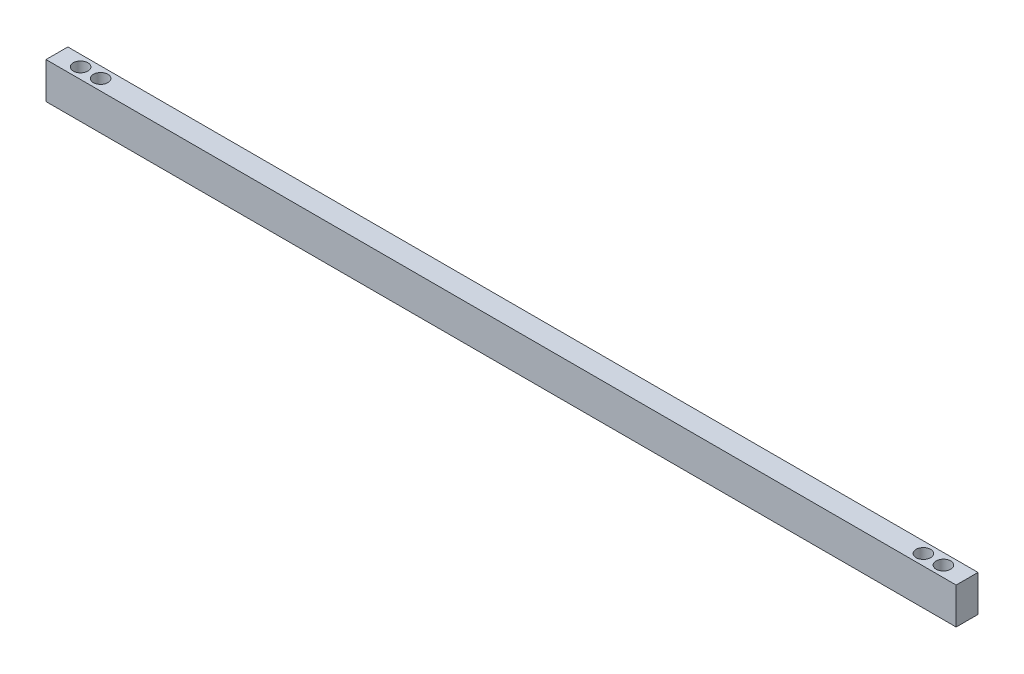
ISO-10303-21;
HEADER;
FILE_DESCRIPTION(('STEP AP214'),'2;1');
FILE_NAME('part.step','',(''),(''),'','','');
FILE_SCHEMA(('AUTOMOTIVE_DESIGN { 1 0 10303 214 1 1 1 1 }'));
ENDSEC;
DATA;
#1=APPLICATION_CONTEXT('core data for automotive mechanical design processes');
#2=APPLICATION_PROTOCOL_DEFINITION('international standard','automotive_design',2000,#1);
#3=PRODUCT_CONTEXT('',#1,'mechanical');
#4=PRODUCT('Part','Part','',(#3));
#5=PRODUCT_RELATED_PRODUCT_CATEGORY('part','',(#4));
#6=PRODUCT_DEFINITION_FORMATION('','',#4);
#7=PRODUCT_DEFINITION_CONTEXT('part definition',#1,'design');
#8=PRODUCT_DEFINITION('design','',#6,#7);
#9=PRODUCT_DEFINITION_SHAPE('','',#8);
#10=(LENGTH_UNIT() NAMED_UNIT(*) SI_UNIT(.MILLI.,.METRE.));
#11=(NAMED_UNIT(*) PLANE_ANGLE_UNIT() SI_UNIT($,.RADIAN.));
#12=(NAMED_UNIT(*) SI_UNIT($,.STERADIAN.) SOLID_ANGLE_UNIT());
#13=UNCERTAINTY_MEASURE_WITH_UNIT(LENGTH_MEASURE(1.E-05),#10,'distance_accuracy_value','');
#14=(GEOMETRIC_REPRESENTATION_CONTEXT(3) GLOBAL_UNCERTAINTY_ASSIGNED_CONTEXT((#13)) GLOBAL_UNIT_ASSIGNED_CONTEXT((#10,
#11,#12)) REPRESENTATION_CONTEXT('',''));
#15=CARTESIAN_POINT('',(0.,0.,0.));
#16=DIRECTION('',(0.,0.,1.));
#17=DIRECTION('',(1.,0.,0.));
#18=AXIS2_PLACEMENT_3D('',#15,#16,#17);
#19=CARTESIAN_POINT('',(317.5,25.4,7.62));
#20=DIRECTION('',(-1.,0.,0.));
#21=DIRECTION('',(0.,0.,1.));
#22=AXIS2_PLACEMENT_3D('',#19,#20,#21);
#23=PLANE('',#22);
#24=DIRECTION('',(0.,0.,-1.));
#25=VECTOR('',#24,1.);
#26=CARTESIAN_POINT('',(317.5,0.,7.62));
#27=LINE('',#26,#25);
#28=CARTESIAN_POINT('',(317.5,0.,7.62));
#29=VERTEX_POINT('',#28);
#30=CARTESIAN_POINT('',(317.5,0.,-7.62));
#31=VERTEX_POINT('',#30);
#32=EDGE_CURVE('E99',#29,#31,#27,.T.);
#33=ORIENTED_EDGE('',*,*,#32,.T.);
#34=DIRECTION('',(0.,-1.,0.));
#35=VECTOR('',#34,1.);
#36=CARTESIAN_POINT('',(317.5,25.4,-7.62));
#37=LINE('',#36,#35);
#38=CARTESIAN_POINT('',(317.5,25.4,-7.62));
#39=VERTEX_POINT('',#38);
#40=EDGE_CURVE('E11',#39,#31,#37,.T.);
#41=ORIENTED_EDGE('',*,*,#40,.F.);
#42=DIRECTION('',(0.,0.,-1.));
#43=VECTOR('',#42,1.);
#44=CARTESIAN_POINT('',(317.5,25.4,7.62));
#45=LINE('',#44,#43);
#46=CARTESIAN_POINT('',(317.5,25.4,7.62));
#47=VERTEX_POINT('',#46);
#48=EDGE_CURVE('E86',#47,#39,#45,.T.);
#49=ORIENTED_EDGE('',*,*,#48,.F.);
#50=DIRECTION('',(0.,-1.,0.));
#51=VECTOR('',#50,1.);
#52=CARTESIAN_POINT('',(317.5,25.4,7.62));
#53=LINE('',#52,#51);
#54=EDGE_CURVE('E95',#47,#29,#53,.T.);
#55=ORIENTED_EDGE('',*,*,#54,.T.);
#56=EDGE_LOOP('',(#33,#41,#49,#55));
#57=FACE_BOUND('',#56,.T.);
#58=ADVANCED_FACE('F33',(#57),#23,.F.);
#59=CARTESIAN_POINT('',(-317.5,25.4,-7.62));
#60=DIRECTION('',(0.,0.,1.));
#61=DIRECTION('',(1.,0.,0.));
#62=AXIS2_PLACEMENT_3D('',#59,#60,#61);
#63=PLANE('',#62);
#64=DIRECTION('',(-1.,0.,0.));
#65=VECTOR('',#64,1.);
#66=CARTESIAN_POINT('',(-317.5,0.,-7.62));
#67=LINE('',#66,#65);
#68=CARTESIAN_POINT('',(-317.5,0.,-7.62));
#69=VERTEX_POINT('',#68);
#70=EDGE_CURVE('E90',#31,#69,#67,.T.);
#71=ORIENTED_EDGE('',*,*,#70,.T.);
#72=DIRECTION('',(0.,-1.,0.));
#73=VECTOR('',#72,1.);
#74=CARTESIAN_POINT('',(-317.5,25.4,-7.62));
#75=LINE('',#74,#73);
#76=CARTESIAN_POINT('',(-317.5,25.4,-7.62));
#77=VERTEX_POINT('',#76);
#78=EDGE_CURVE('E42',#77,#69,#75,.T.);
#79=ORIENTED_EDGE('',*,*,#78,.F.);
#80=DIRECTION('',(-1.,0.,0.));
#81=VECTOR('',#80,1.);
#82=CARTESIAN_POINT('',(-317.5,25.4,-7.62));
#83=LINE('',#82,#81);
#84=EDGE_CURVE('E81',#39,#77,#83,.T.);
#85=ORIENTED_EDGE('',*,*,#84,.F.);
#86=ORIENTED_EDGE('',*,*,#40,.T.);
#87=EDGE_LOOP('',(#71,#79,#85,#86));
#88=FACE_BOUND('',#87,.T.);
#89=ADVANCED_FACE('F89',(#88),#63,.F.);
#90=CARTESIAN_POINT('',(-317.5,25.4,7.62));
#91=DIRECTION('',(1.,0.,0.));
#92=DIRECTION('',(0.,0.,-1.));
#93=AXIS2_PLACEMENT_3D('',#90,#91,#92);
#94=PLANE('',#93);
#95=DIRECTION('',(0.,0.,1.));
#96=VECTOR('',#95,1.);
#97=CARTESIAN_POINT('',(-317.5,0.,7.62));
#98=LINE('',#97,#96);
#99=CARTESIAN_POINT('',(-317.5,0.,7.62));
#100=VERTEX_POINT('',#99);
#101=EDGE_CURVE('E68',#69,#100,#98,.T.);
#102=ORIENTED_EDGE('',*,*,#101,.T.);
#103=DIRECTION('',(0.,-1.,0.));
#104=VECTOR('',#103,1.);
#105=CARTESIAN_POINT('',(-317.5,25.4,7.62));
#106=LINE('',#105,#104);
#107=CARTESIAN_POINT('',(-317.5,25.4,7.62));
#108=VERTEX_POINT('',#107);
#109=EDGE_CURVE('E91',#108,#100,#106,.T.);
#110=ORIENTED_EDGE('',*,*,#109,.F.);
#111=DIRECTION('',(0.,0.,1.));
#112=VECTOR('',#111,1.);
#113=CARTESIAN_POINT('',(-317.5,25.4,7.62));
#114=LINE('',#113,#112);
#115=EDGE_CURVE('E84',#77,#108,#114,.T.);
#116=ORIENTED_EDGE('',*,*,#115,.F.);
#117=ORIENTED_EDGE('',*,*,#78,.T.);
#118=EDGE_LOOP('',(#102,#110,#116,#117));
#119=FACE_BOUND('',#118,.T.);
#120=ADVANCED_FACE('F93',(#119),#94,.F.);
#121=CARTESIAN_POINT('',(-317.5,25.4,7.62));
#122=DIRECTION('',(0.,0.,-1.));
#123=DIRECTION('',(-1.,0.,0.));
#124=AXIS2_PLACEMENT_3D('',#121,#122,#123);
#125=PLANE('',#124);
#126=DIRECTION('',(1.,0.,0.));
#127=VECTOR('',#126,1.);
#128=CARTESIAN_POINT('',(-317.5,0.,7.62));
#129=LINE('',#128,#127);
#130=EDGE_CURVE('E74',#100,#29,#129,.T.);
#131=ORIENTED_EDGE('',*,*,#130,.T.);
#132=ORIENTED_EDGE('',*,*,#54,.F.);
#133=DIRECTION('',(1.,0.,0.));
#134=VECTOR('',#133,1.);
#135=CARTESIAN_POINT('',(-317.5,25.4,7.62));
#136=LINE('',#135,#134);
#137=EDGE_CURVE('E51',#108,#47,#136,.T.);
#138=ORIENTED_EDGE('',*,*,#137,.F.);
#139=ORIENTED_EDGE('',*,*,#109,.T.);
#140=EDGE_LOOP('',(#131,#132,#138,#139));
#141=FACE_BOUND('',#140,.T.);
#142=ADVANCED_FACE('F140',(#141),#125,.F.);
#143=CARTESIAN_POINT('',(0.,25.4,0.));
#144=DIRECTION('',(0.,-1.,0.));
#145=DIRECTION('',(0.,0.,-1.));
#146=AXIS2_PLACEMENT_3D('',#143,#144,#145);
#147=PLANE('',#146);
#148=CARTESIAN_POINT('',(-287.02,25.4,0.));
#149=DIRECTION('',(0.,1.,0.));
#150=DIRECTION('',(0.,0.,1.));
#151=AXIS2_PLACEMENT_3D('',#148,#149,#150);
#152=CIRCLE('',#151,5.07999999999996);
#153=CARTESIAN_POINT('',(-287.02,25.4,5.07999999999996));
#154=VERTEX_POINT('',#153);
#155=EDGE_CURVE('E114',#154,#154,#152,.T.);
#156=ORIENTED_EDGE('',*,*,#155,.F.);
#157=EDGE_LOOP('',(#156));
#158=FACE_BOUND('',#157,.T.);
#159=CARTESIAN_POINT('',(300.99,25.4,0.));
#160=DIRECTION('',(0.,1.,0.));
#161=DIRECTION('',(0.,0.,1.));
#162=AXIS2_PLACEMENT_3D('',#159,#160,#161);
#163=CIRCLE('',#162,5.07999999999996);
#164=CARTESIAN_POINT('',(300.99,25.4,5.07999999999996));
#165=VERTEX_POINT('',#164);
#166=EDGE_CURVE('E129',#165,#165,#163,.T.);
#167=ORIENTED_EDGE('',*,*,#166,.F.);
#168=EDGE_LOOP('',(#167));
#169=FACE_BOUND('',#168,.T.);
#170=CARTESIAN_POINT('',(287.02,25.4,0.));
#171=DIRECTION('',(0.,1.,0.));
#172=DIRECTION('',(0.,0.,1.));
#173=AXIS2_PLACEMENT_3D('',#170,#171,#172);
#174=CIRCLE('',#173,5.07999999999996);
#175=CARTESIAN_POINT('',(287.02,25.4,5.07999999999996));
#176=VERTEX_POINT('',#175);
#177=EDGE_CURVE('E126',#176,#176,#174,.T.);
#178=ORIENTED_EDGE('',*,*,#177,.F.);
#179=EDGE_LOOP('',(#178));
#180=FACE_BOUND('',#179,.T.);
#181=CARTESIAN_POINT('',(-300.99,25.4,0.));
#182=DIRECTION('',(0.,1.,0.));
#183=DIRECTION('',(0.,0.,1.));
#184=AXIS2_PLACEMENT_3D('',#181,#182,#183);
#185=CIRCLE('',#184,5.07999999999996);
#186=CARTESIAN_POINT('',(-300.99,25.4,5.07999999999996));
#187=VERTEX_POINT('',#186);
#188=EDGE_CURVE('E110',#187,#187,#185,.T.);
#189=ORIENTED_EDGE('',*,*,#188,.F.);
#190=EDGE_LOOP('',(#189));
#191=FACE_BOUND('',#190,.T.);
#192=ORIENTED_EDGE('',*,*,#48,.T.);
#193=ORIENTED_EDGE('',*,*,#84,.T.);
#194=ORIENTED_EDGE('',*,*,#115,.T.);
#195=ORIENTED_EDGE('',*,*,#137,.T.);
#196=EDGE_LOOP('',(#192,#193,#194,#195));
#197=FACE_BOUND('',#196,.T.);
#198=ADVANCED_FACE('F82',(#158,#169,#180,#191,#197),#147,.F.);
#199=CARTESIAN_POINT('',(0.,0.,0.));
#200=DIRECTION('',(0.,-1.,0.));
#201=DIRECTION('',(0.,0.,-1.));
#202=AXIS2_PLACEMENT_3D('',#199,#200,#201);
#203=PLANE('',#202);
#204=CARTESIAN_POINT('',(-287.02,0.,0.));
#205=DIRECTION('',(0.,-1.,0.));
#206=DIRECTION('',(0.,0.,-1.));
#207=AXIS2_PLACEMENT_3D('',#204,#205,#206);
#208=CIRCLE('',#207,5.07999999999996);
#209=CARTESIAN_POINT('',(-287.02,0.,-5.07999999999996));
#210=VERTEX_POINT('',#209);
#211=EDGE_CURVE('E36',#210,#210,#208,.T.);
#212=ORIENTED_EDGE('',*,*,#211,.F.);
#213=EDGE_LOOP('',(#212));
#214=FACE_BOUND('',#213,.T.);
#215=CARTESIAN_POINT('',(300.99,0.,0.));
#216=DIRECTION('',(0.,-1.,0.));
#217=DIRECTION('',(0.,0.,-1.));
#218=AXIS2_PLACEMENT_3D('',#215,#216,#217);
#219=CIRCLE('',#218,5.07999999999996);
#220=CARTESIAN_POINT('',(300.99,0.,-5.07999999999996));
#221=VERTEX_POINT('',#220);
#222=EDGE_CURVE('E113',#221,#221,#219,.T.);
#223=ORIENTED_EDGE('',*,*,#222,.F.);
#224=EDGE_LOOP('',(#223));
#225=FACE_BOUND('',#224,.T.);
#226=CARTESIAN_POINT('',(287.02,0.,0.));
#227=DIRECTION('',(0.,-1.,0.));
#228=DIRECTION('',(0.,0.,-1.));
#229=AXIS2_PLACEMENT_3D('',#226,#227,#228);
#230=CIRCLE('',#229,5.07999999999996);
#231=CARTESIAN_POINT('',(287.02,0.,-5.07999999999996));
#232=VERTEX_POINT('',#231);
#233=EDGE_CURVE('E111',#232,#232,#230,.T.);
#234=ORIENTED_EDGE('',*,*,#233,.F.);
#235=EDGE_LOOP('',(#234));
#236=FACE_BOUND('',#235,.T.);
#237=CARTESIAN_POINT('',(-300.99,0.,0.));
#238=DIRECTION('',(0.,-1.,0.));
#239=DIRECTION('',(0.,0.,-1.));
#240=AXIS2_PLACEMENT_3D('',#237,#238,#239);
#241=CIRCLE('',#240,5.07999999999996);
#242=CARTESIAN_POINT('',(-300.99,0.,-5.07999999999996));
#243=VERTEX_POINT('',#242);
#244=EDGE_CURVE('E102',#243,#243,#241,.T.);
#245=ORIENTED_EDGE('',*,*,#244,.F.);
#246=EDGE_LOOP('',(#245));
#247=FACE_BOUND('',#246,.T.);
#248=ORIENTED_EDGE('',*,*,#32,.F.);
#249=ORIENTED_EDGE('',*,*,#130,.F.);
#250=ORIENTED_EDGE('',*,*,#101,.F.);
#251=ORIENTED_EDGE('',*,*,#70,.F.);
#252=EDGE_LOOP('',(#248,#249,#250,#251));
#253=FACE_BOUND('',#252,.T.);
#254=ADVANCED_FACE('F139',(#214,#225,#236,#247,#253),#203,.T.);
#255=CARTESIAN_POINT('',(-300.99,-2.54,0.));
#256=DIRECTION('',(0.,1.,0.));
#257=DIRECTION('',(0.,0.,1.));
#258=AXIS2_PLACEMENT_3D('',#255,#256,#257);
#259=CYLINDRICAL_SURFACE('',#258,5.07999999999996);
#260=ORIENTED_EDGE('',*,*,#244,.T.);
#261=EDGE_LOOP('',(#260));
#262=FACE_BOUND('',#261,.T.);
#263=ORIENTED_EDGE('',*,*,#188,.T.);
#264=EDGE_LOOP('',(#263));
#265=FACE_BOUND('',#264,.T.);
#266=ADVANCED_FACE('F150',(#262,#265),#259,.F.);
#267=CARTESIAN_POINT('',(287.02,-2.54,0.));
#268=DIRECTION('',(0.,1.,0.));
#269=DIRECTION('',(0.,0.,1.));
#270=AXIS2_PLACEMENT_3D('',#267,#268,#269);
#271=CYLINDRICAL_SURFACE('',#270,5.07999999999996);
#272=ORIENTED_EDGE('',*,*,#233,.T.);
#273=EDGE_LOOP('',(#272));
#274=FACE_BOUND('',#273,.T.);
#275=ORIENTED_EDGE('',*,*,#177,.T.);
#276=EDGE_LOOP('',(#275));
#277=FACE_BOUND('',#276,.T.);
#278=ADVANCED_FACE('F147',(#274,#277),#271,.F.);
#279=CARTESIAN_POINT('',(300.99,-2.54,0.));
#280=DIRECTION('',(0.,1.,0.));
#281=DIRECTION('',(0.,0.,1.));
#282=AXIS2_PLACEMENT_3D('',#279,#280,#281);
#283=CYLINDRICAL_SURFACE('',#282,5.07999999999996);
#284=ORIENTED_EDGE('',*,*,#222,.T.);
#285=EDGE_LOOP('',(#284));
#286=FACE_BOUND('',#285,.T.);
#287=ORIENTED_EDGE('',*,*,#166,.T.);
#288=EDGE_LOOP('',(#287));
#289=FACE_BOUND('',#288,.T.);
#290=ADVANCED_FACE('F149',(#286,#289),#283,.F.);
#291=CARTESIAN_POINT('',(-287.02,-2.54,0.));
#292=DIRECTION('',(0.,1.,0.));
#293=DIRECTION('',(0.,0.,1.));
#294=AXIS2_PLACEMENT_3D('',#291,#292,#293);
#295=CYLINDRICAL_SURFACE('',#294,5.07999999999996);
#296=ORIENTED_EDGE('',*,*,#211,.T.);
#297=EDGE_LOOP('',(#296));
#298=FACE_BOUND('',#297,.T.);
#299=ORIENTED_EDGE('',*,*,#155,.T.);
#300=EDGE_LOOP('',(#299));
#301=FACE_BOUND('',#300,.T.);
#302=ADVANCED_FACE('F135',(#298,#301),#295,.F.);
#303=CLOSED_SHELL('',(#58,#89,#120,#142,#198,#254,#266,#278,#290,#302));
#304=MANIFOLD_SOLID_BREP('B2',#303);
#305=ADVANCED_BREP_SHAPE_REPRESENTATION('',(#18,#304),#14);
#306=SHAPE_DEFINITION_REPRESENTATION(#9,#305);
ENDSEC;
END-ISO-10303-21;
